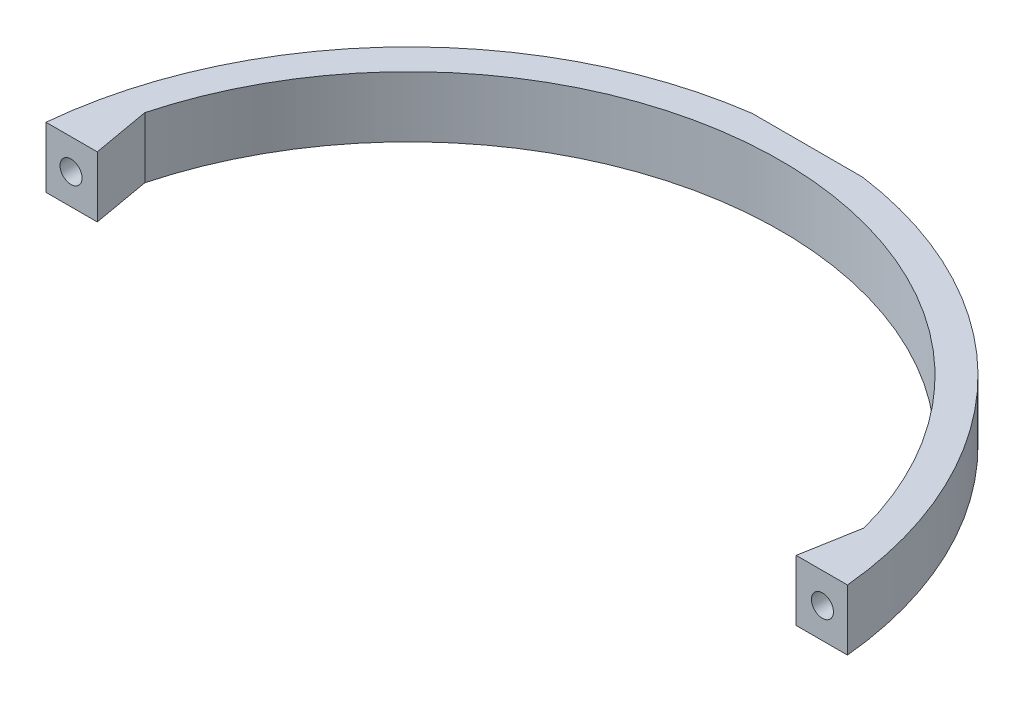
ISO-10303-21;
HEADER;
FILE_DESCRIPTION(('STEP AP214'),'2;1');
FILE_NAME('part.step','',(''),(''),'','','');
FILE_SCHEMA(('AUTOMOTIVE_DESIGN { 1 0 10303 214 1 1 1 1 }'));
ENDSEC;
DATA;
#1=APPLICATION_CONTEXT('core data for automotive mechanical design processes');
#2=APPLICATION_PROTOCOL_DEFINITION('international standard','automotive_design',2000,#1);
#3=PRODUCT_CONTEXT('',#1,'mechanical');
#4=PRODUCT('Part','Part','',(#3));
#5=PRODUCT_RELATED_PRODUCT_CATEGORY('part','',(#4));
#6=PRODUCT_DEFINITION_FORMATION('','',#4);
#7=PRODUCT_DEFINITION_CONTEXT('part definition',#1,'design');
#8=PRODUCT_DEFINITION('design','',#6,#7);
#9=PRODUCT_DEFINITION_SHAPE('','',#8);
#10=(LENGTH_UNIT() NAMED_UNIT(*) SI_UNIT(.MILLI.,.METRE.));
#11=(NAMED_UNIT(*) PLANE_ANGLE_UNIT() SI_UNIT($,.RADIAN.));
#12=(NAMED_UNIT(*) SI_UNIT($,.STERADIAN.) SOLID_ANGLE_UNIT());
#13=UNCERTAINTY_MEASURE_WITH_UNIT(LENGTH_MEASURE(1.E-05),#10,'distance_accuracy_value','');
#14=(GEOMETRIC_REPRESENTATION_CONTEXT(3) GLOBAL_UNCERTAINTY_ASSIGNED_CONTEXT((#13)) GLOBAL_UNIT_ASSIGNED_CONTEXT((#10,
#11,#12)) REPRESENTATION_CONTEXT('',''));
#15=CARTESIAN_POINT('',(0.,0.,0.));
#16=DIRECTION('',(0.,0.,1.));
#17=DIRECTION('',(1.,0.,0.));
#18=AXIS2_PLACEMENT_3D('',#15,#16,#17);
#19=CARTESIAN_POINT('',(0.,8.,0.));
#20=DIRECTION('',(0.,-1.,0.));
#21=DIRECTION('',(0.,0.,-1.));
#22=AXIS2_PLACEMENT_3D('',#19,#20,#21);
#23=CYLINDRICAL_SURFACE('',#22,53.);
#24=CARTESIAN_POINT('',(0.,0.,0.));
#25=DIRECTION('',(0.,1.,0.));
#26=DIRECTION('',(0.,0.,-1.));
#27=AXIS2_PLACEMENT_3D('',#24,#25,#26);
#28=CIRCLE('',#27,53.);
#29=CARTESIAN_POINT('',(52.7636238330917,0.,-5.));
#30=VERTEX_POINT('',#29);
#31=CARTESIAN_POINT('',(7.26291952316698,0.,-52.5));
#32=VERTEX_POINT('',#31);
#33=EDGE_CURVE('E131',#30,#32,#28,.T.);
#34=ORIENTED_EDGE('',*,*,#33,.T.);
#35=DIRECTION('',(0.,-1.,0.));
#36=VECTOR('',#35,1.);
#37=CARTESIAN_POINT('',(7.26291952316698,8.,-52.5));
#38=LINE('',#37,#36);
#39=CARTESIAN_POINT('',(7.26291952316698,8.,-52.5));
#40=VERTEX_POINT('',#39);
#41=EDGE_CURVE('E11',#40,#32,#38,.T.);
#42=ORIENTED_EDGE('',*,*,#41,.F.);
#43=CARTESIAN_POINT('',(0.,8.,0.));
#44=DIRECTION('',(0.,1.,0.));
#45=DIRECTION('',(0.,0.,-1.));
#46=AXIS2_PLACEMENT_3D('',#43,#44,#45);
#47=CIRCLE('',#46,53.);
#48=CARTESIAN_POINT('',(52.7636238330917,8.,-5.));
#49=VERTEX_POINT('',#48);
#50=EDGE_CURVE('E146',#49,#40,#47,.T.);
#51=ORIENTED_EDGE('',*,*,#50,.F.);
#52=DIRECTION('',(0.,-1.,0.));
#53=VECTOR('',#52,1.);
#54=CARTESIAN_POINT('',(52.7636238330917,8.,-5.));
#55=LINE('',#54,#53);
#56=EDGE_CURVE('E127',#49,#30,#55,.T.);
#57=ORIENTED_EDGE('',*,*,#56,.T.);
#58=EDGE_LOOP('',(#34,#42,#51,#57));
#59=FACE_BOUND('',#58,.T.);
#60=ADVANCED_FACE('F35',(#59),#23,.T.);
#61=CARTESIAN_POINT('',(-7.26291952316698,8.,-52.5));
#62=DIRECTION('',(0.,0.,1.));
#63=DIRECTION('',(1.,0.,0.));
#64=AXIS2_PLACEMENT_3D('',#61,#62,#63);
#65=PLANE('',#64);
#66=CARTESIAN_POINT('',(0.,4.,-52.5));
#67=DIRECTION('',(0.,0.,-1.));
#68=DIRECTION('',(-1.,0.,0.));
#69=AXIS2_PLACEMENT_3D('',#66,#67,#68);
#70=CIRCLE('',#69,3.025);
#71=CARTESIAN_POINT('',(-3.025,4.,-52.5));
#72=VERTEX_POINT('',#71);
#73=EDGE_CURVE('E179',#72,#72,#70,.T.);
#74=ORIENTED_EDGE('',*,*,#73,.F.);
#75=EDGE_LOOP('',(#74));
#76=FACE_BOUND('',#75,.T.);
#77=DIRECTION('',(-1.,0.,0.));
#78=VECTOR('',#77,1.);
#79=CARTESIAN_POINT('',(-7.26291952316698,0.,-52.5));
#80=LINE('',#79,#78);
#81=CARTESIAN_POINT('',(-7.26291952316698,0.,-52.5));
#82=VERTEX_POINT('',#81);
#83=EDGE_CURVE('E134',#32,#82,#80,.T.);
#84=ORIENTED_EDGE('',*,*,#83,.T.);
#85=DIRECTION('',(0.,-1.,0.));
#86=VECTOR('',#85,1.);
#87=CARTESIAN_POINT('',(-7.26291952316698,8.,-52.5));
#88=LINE('',#87,#86);
#89=CARTESIAN_POINT('',(-7.26291952316698,8.,-52.5));
#90=VERTEX_POINT('',#89);
#91=EDGE_CURVE('E43',#90,#82,#88,.T.);
#92=ORIENTED_EDGE('',*,*,#91,.F.);
#93=DIRECTION('',(-1.,0.,0.));
#94=VECTOR('',#93,1.);
#95=CARTESIAN_POINT('',(-7.26291952316698,8.,-52.5));
#96=LINE('',#95,#94);
#97=EDGE_CURVE('E94',#40,#90,#96,.T.);
#98=ORIENTED_EDGE('',*,*,#97,.F.);
#99=ORIENTED_EDGE('',*,*,#41,.T.);
#100=EDGE_LOOP('',(#84,#92,#98,#99));
#101=FACE_BOUND('',#100,.T.);
#102=ADVANCED_FACE('F225',(#76,#101),#65,.F.);
#103=CARTESIAN_POINT('',(0.,8.,0.));
#104=DIRECTION('',(0.,-1.,0.));
#105=DIRECTION('',(0.,0.,-1.));
#106=AXIS2_PLACEMENT_3D('',#103,#104,#105);
#107=CYLINDRICAL_SURFACE('',#106,53.);
#108=CARTESIAN_POINT('',(0.,0.,0.));
#109=DIRECTION('',(0.,1.,0.));
#110=DIRECTION('',(0.,0.,-1.));
#111=AXIS2_PLACEMENT_3D('',#108,#109,#110);
#112=CIRCLE('',#111,53.);
#113=CARTESIAN_POINT('',(-52.7636238330917,0.,-5.));
#114=VERTEX_POINT('',#113);
#115=EDGE_CURVE('E137',#82,#114,#112,.T.);
#116=ORIENTED_EDGE('',*,*,#115,.T.);
#117=DIRECTION('',(0.,-1.,0.));
#118=VECTOR('',#117,1.);
#119=CARTESIAN_POINT('',(-52.7636238330917,8.,-5.));
#120=LINE('',#119,#118);
#121=CARTESIAN_POINT('',(-52.7636238330917,8.,-5.));
#122=VERTEX_POINT('',#121);
#123=EDGE_CURVE('E153',#122,#114,#120,.T.);
#124=ORIENTED_EDGE('',*,*,#123,.F.);
#125=CARTESIAN_POINT('',(0.,8.,0.));
#126=DIRECTION('',(0.,1.,0.));
#127=DIRECTION('',(0.,0.,-1.));
#128=AXIS2_PLACEMENT_3D('',#125,#126,#127);
#129=CIRCLE('',#128,53.);
#130=EDGE_CURVE('E161',#90,#122,#129,.T.);
#131=ORIENTED_EDGE('',*,*,#130,.F.);
#132=ORIENTED_EDGE('',*,*,#91,.T.);
#133=EDGE_LOOP('',(#116,#124,#131,#132));
#134=FACE_BOUND('',#133,.T.);
#135=ADVANCED_FACE('F159',(#134),#107,.T.);
#136=CARTESIAN_POINT('',(-52.7636238330917,8.,-5.));
#137=DIRECTION('',(0.,0.,-1.));
#138=DIRECTION('',(-1.,0.,0.));
#139=AXIS2_PLACEMENT_3D('',#136,#137,#138);
#140=PLANE('',#139);
#141=CARTESIAN_POINT('',(-49.47,4.,-5.));
#142=DIRECTION('',(0.,0.,1.));
#143=DIRECTION('',(1.,0.,0.));
#144=AXIS2_PLACEMENT_3D('',#141,#142,#143);
#145=CIRCLE('',#144,1.45);
#146=CARTESIAN_POINT('',(-48.02,4.,-5.));
#147=VERTEX_POINT('',#146);
#148=EDGE_CURVE('E185',#147,#147,#145,.T.);
#149=ORIENTED_EDGE('',*,*,#148,.F.);
#150=EDGE_LOOP('',(#149));
#151=FACE_BOUND('',#150,.T.);
#152=DIRECTION('',(1.,0.,0.));
#153=VECTOR('',#152,1.);
#154=CARTESIAN_POINT('',(-52.7636238330917,0.,-5.));
#155=LINE('',#154,#153);
#156=CARTESIAN_POINT('',(-46.0136238330917,0.,-5.));
#157=VERTEX_POINT('',#156);
#158=EDGE_CURVE('E139',#114,#157,#155,.T.);
#159=ORIENTED_EDGE('',*,*,#158,.T.);
#160=DIRECTION('',(0.,-1.,0.));
#161=VECTOR('',#160,1.);
#162=CARTESIAN_POINT('',(-46.0136238330917,8.,-5.));
#163=LINE('',#162,#161);
#164=CARTESIAN_POINT('',(-46.0136238330917,8.,-5.));
#165=VERTEX_POINT('',#164);
#166=EDGE_CURVE('E150',#165,#157,#163,.T.);
#167=ORIENTED_EDGE('',*,*,#166,.F.);
#168=DIRECTION('',(1.,0.,0.));
#169=VECTOR('',#168,1.);
#170=CARTESIAN_POINT('',(-52.7636238330917,8.,-5.));
#171=LINE('',#170,#169);
#172=EDGE_CURVE('E173',#122,#165,#171,.T.);
#173=ORIENTED_EDGE('',*,*,#172,.F.);
#174=ORIENTED_EDGE('',*,*,#123,.T.);
#175=EDGE_LOOP('',(#159,#167,#173,#174));
#176=FACE_BOUND('',#175,.T.);
#177=ADVANCED_FACE('F169',(#151,#176),#140,.F.);
#178=CARTESIAN_POINT('',(-46.0136238330917,8.,-5.));
#179=DIRECTION('',(-0.984807753012207,0.,0.173648177666935));
#180=DIRECTION('',(0.173648177666935,0.,0.984807753012207));
#181=AXIS2_PLACEMENT_3D('',#178,#179,#180);
#182=PLANE('',#181);
#183=DIRECTION('',(-0.173648177666935,0.,-0.984807753012207));
#184=VECTOR('',#183,1.);
#185=CARTESIAN_POINT('',(-46.0136238330917,0.,-5.));
#186=LINE('',#185,#184);
#187=CARTESIAN_POINT('',(-47.3531459973294,0.,-12.5968076970162));
#188=VERTEX_POINT('',#187);
#189=EDGE_CURVE('E141',#157,#188,#186,.T.);
#190=ORIENTED_EDGE('',*,*,#189,.T.);
#191=DIRECTION('',(0.,-1.,0.));
#192=VECTOR('',#191,1.);
#193=CARTESIAN_POINT('',(-47.3531459973294,8.,-12.5968076970162));
#194=LINE('',#193,#192);
#195=CARTESIAN_POINT('',(-47.3531459973294,8.,-12.5968076970162));
#196=VERTEX_POINT('',#195);
#197=EDGE_CURVE('E122',#196,#188,#194,.T.);
#198=ORIENTED_EDGE('',*,*,#197,.F.);
#199=DIRECTION('',(-0.173648177666935,0.,-0.984807753012207));
#200=VECTOR('',#199,1.);
#201=CARTESIAN_POINT('',(-46.0136238330917,8.,-5.));
#202=LINE('',#201,#200);
#203=EDGE_CURVE('E113',#165,#196,#202,.T.);
#204=ORIENTED_EDGE('',*,*,#203,.F.);
#205=ORIENTED_EDGE('',*,*,#166,.T.);
#206=EDGE_LOOP('',(#190,#198,#204,#205));
#207=FACE_BOUND('',#206,.T.);
#208=ADVANCED_FACE('F172',(#207),#182,.F.);
#209=CARTESIAN_POINT('',(0.,8.,0.));
#210=DIRECTION('',(0.,-1.,0.));
#211=DIRECTION('',(0.,0.,-1.));
#212=AXIS2_PLACEMENT_3D('',#209,#210,#211);
#213=CYLINDRICAL_SURFACE('',#212,49.);
#214=CARTESIAN_POINT('',(0.,0.,0.));
#215=DIRECTION('',(0.,-1.,0.));
#216=DIRECTION('',(0.,0.,-1.));
#217=AXIS2_PLACEMENT_3D('',#214,#215,#216);
#218=CIRCLE('',#217,49.);
#219=CARTESIAN_POINT('',(47.3531459973294,0.,-12.5968076970162));
#220=VERTEX_POINT('',#219);
#221=EDGE_CURVE('E121',#188,#220,#218,.T.);
#222=ORIENTED_EDGE('',*,*,#221,.T.);
#223=DIRECTION('',(0.,-1.,0.));
#224=VECTOR('',#223,1.);
#225=CARTESIAN_POINT('',(47.3531459973294,8.,-12.5968076970162));
#226=LINE('',#225,#224);
#227=CARTESIAN_POINT('',(47.3531459973294,8.,-12.5968076970162));
#228=VERTEX_POINT('',#227);
#229=EDGE_CURVE('E118',#228,#220,#226,.T.);
#230=ORIENTED_EDGE('',*,*,#229,.F.);
#231=CARTESIAN_POINT('',(0.,8.,0.));
#232=DIRECTION('',(0.,-1.,0.));
#233=DIRECTION('',(0.,0.,-1.));
#234=AXIS2_PLACEMENT_3D('',#231,#232,#233);
#235=CIRCLE('',#234,49.);
#236=EDGE_CURVE('E107',#196,#228,#235,.T.);
#237=ORIENTED_EDGE('',*,*,#236,.F.);
#238=ORIENTED_EDGE('',*,*,#197,.T.);
#239=EDGE_LOOP('',(#222,#230,#237,#238));
#240=FACE_BOUND('',#239,.T.);
#241=ADVANCED_FACE('F119',(#240),#213,.F.);
#242=CARTESIAN_POINT('',(46.0136238330917,8.,-5.));
#243=DIRECTION('',(0.984807753012207,0.,0.173648177666935));
#244=DIRECTION('',(0.173648177666935,0.,-0.984807753012207));
#245=AXIS2_PLACEMENT_3D('',#242,#243,#244);
#246=PLANE('',#245);
#247=DIRECTION('',(-0.173648177666935,0.,0.984807753012207));
#248=VECTOR('',#247,1.);
#249=CARTESIAN_POINT('',(46.0136238330917,0.,-5.));
#250=LINE('',#249,#248);
#251=CARTESIAN_POINT('',(46.0136238330917,0.,-5.));
#252=VERTEX_POINT('',#251);
#253=EDGE_CURVE('E80',#220,#252,#250,.T.);
#254=ORIENTED_EDGE('',*,*,#253,.T.);
#255=DIRECTION('',(0.,-1.,0.));
#256=VECTOR('',#255,1.);
#257=CARTESIAN_POINT('',(46.0136238330917,8.,-5.));
#258=LINE('',#257,#256);
#259=CARTESIAN_POINT('',(46.0136238330917,8.,-5.));
#260=VERTEX_POINT('',#259);
#261=EDGE_CURVE('E123',#260,#252,#258,.T.);
#262=ORIENTED_EDGE('',*,*,#261,.F.);
#263=DIRECTION('',(-0.173648177666935,0.,0.984807753012207));
#264=VECTOR('',#263,1.);
#265=CARTESIAN_POINT('',(46.0136238330917,8.,-5.));
#266=LINE('',#265,#264);
#267=EDGE_CURVE('E111',#228,#260,#266,.T.);
#268=ORIENTED_EDGE('',*,*,#267,.F.);
#269=ORIENTED_EDGE('',*,*,#229,.T.);
#270=EDGE_LOOP('',(#254,#262,#268,#269));
#271=FACE_BOUND('',#270,.T.);
#272=ADVANCED_FACE('F125',(#271),#246,.F.);
#273=CARTESIAN_POINT('',(52.7636238330917,8.,-5.));
#274=DIRECTION('',(0.,0.,-1.));
#275=DIRECTION('',(-1.,0.,0.));
#276=AXIS2_PLACEMENT_3D('',#273,#274,#275);
#277=PLANE('',#276);
#278=CARTESIAN_POINT('',(49.47,4.,-5.));
#279=DIRECTION('',(0.,0.,-1.));
#280=DIRECTION('',(-1.,0.,0.));
#281=AXIS2_PLACEMENT_3D('',#278,#279,#280);
#282=CIRCLE('',#281,1.45);
#283=CARTESIAN_POINT('',(50.92,4.,-5.));
#284=VERTEX_POINT('',#283);
#285=EDGE_CURVE('E191',#284,#284,#282,.T.);
#286=ORIENTED_EDGE('',*,*,#285,.T.);
#287=EDGE_LOOP('',(#286));
#288=FACE_BOUND('',#287,.T.);
#289=DIRECTION('',(1.,0.,0.));
#290=VECTOR('',#289,1.);
#291=CARTESIAN_POINT('',(52.7636238330917,0.,-5.));
#292=LINE('',#291,#290);
#293=EDGE_CURVE('E86',#252,#30,#292,.T.);
#294=ORIENTED_EDGE('',*,*,#293,.T.);
#295=ORIENTED_EDGE('',*,*,#56,.F.);
#296=DIRECTION('',(1.,0.,0.));
#297=VECTOR('',#296,1.);
#298=CARTESIAN_POINT('',(52.7636238330917,8.,-5.));
#299=LINE('',#298,#297);
#300=EDGE_CURVE('E51',#260,#49,#299,.T.);
#301=ORIENTED_EDGE('',*,*,#300,.F.);
#302=ORIENTED_EDGE('',*,*,#261,.T.);
#303=EDGE_LOOP('',(#294,#295,#301,#302));
#304=FACE_BOUND('',#303,.T.);
#305=ADVANCED_FACE('F230',(#288,#304),#277,.F.);
#306=CARTESIAN_POINT('',(0.,8.,0.));
#307=DIRECTION('',(0.,-1.,0.));
#308=DIRECTION('',(0.,0.,-1.));
#309=AXIS2_PLACEMENT_3D('',#306,#307,#308);
#310=PLANE('',#309);
#311=ORIENTED_EDGE('',*,*,#50,.T.);
#312=ORIENTED_EDGE('',*,*,#97,.T.);
#313=ORIENTED_EDGE('',*,*,#130,.T.);
#314=ORIENTED_EDGE('',*,*,#172,.T.);
#315=ORIENTED_EDGE('',*,*,#203,.T.);
#316=ORIENTED_EDGE('',*,*,#236,.T.);
#317=ORIENTED_EDGE('',*,*,#267,.T.);
#318=ORIENTED_EDGE('',*,*,#300,.T.);
#319=EDGE_LOOP('',(#311,#312,#313,#314,#315,#316,#317,#318));
#320=FACE_BOUND('',#319,.T.);
#321=ADVANCED_FACE('F109',(#320),#310,.F.);
#322=CARTESIAN_POINT('',(0.,0.,0.));
#323=DIRECTION('',(0.,-1.,0.));
#324=DIRECTION('',(0.,0.,-1.));
#325=AXIS2_PLACEMENT_3D('',#322,#323,#324);
#326=PLANE('',#325);
#327=ORIENTED_EDGE('',*,*,#33,.F.);
#328=ORIENTED_EDGE('',*,*,#293,.F.);
#329=ORIENTED_EDGE('',*,*,#253,.F.);
#330=ORIENTED_EDGE('',*,*,#221,.F.);
#331=ORIENTED_EDGE('',*,*,#189,.F.);
#332=ORIENTED_EDGE('',*,*,#158,.F.);
#333=ORIENTED_EDGE('',*,*,#115,.F.);
#334=ORIENTED_EDGE('',*,*,#83,.F.);
#335=EDGE_LOOP('',(#327,#328,#329,#330,#331,#332,#333,#334));
#336=FACE_BOUND('',#335,.T.);
#337=ADVANCED_FACE('F165',(#336),#326,.T.);
#338=CARTESIAN_POINT('',(0.,4.,-50.4));
#339=DIRECTION('',(0.,0.,-1.));
#340=DIRECTION('',(-1.,0.,0.));
#341=AXIS2_PLACEMENT_3D('',#338,#339,#340);
#342=CYLINDRICAL_SURFACE('',#341,3.025);
#343=CARTESIAN_POINT('',(0.,4.,-50.4));
#344=DIRECTION('',(0.,0.,-1.));
#345=DIRECTION('',(-1.,0.,0.));
#346=AXIS2_PLACEMENT_3D('',#343,#344,#345);
#347=CIRCLE('',#346,3.025);
#348=CARTESIAN_POINT('',(-3.025,4.,-50.4));
#349=VERTEX_POINT('',#348);
#350=EDGE_CURVE('E135',#349,#349,#347,.T.);
#351=ORIENTED_EDGE('',*,*,#350,.F.);
#352=EDGE_LOOP('',(#351));
#353=FACE_BOUND('',#352,.T.);
#354=ORIENTED_EDGE('',*,*,#73,.T.);
#355=EDGE_LOOP('',(#354));
#356=FACE_BOUND('',#355,.T.);
#357=ADVANCED_FACE('F216',(#353,#356),#342,.F.);
#358=CARTESIAN_POINT('',(0.,4.,-50.4));
#359=DIRECTION('',(0.,0.,-1.));
#360=DIRECTION('',(-1.,0.,0.));
#361=AXIS2_PLACEMENT_3D('',#358,#359,#360);
#362=PLANE('',#361);
#363=CARTESIAN_POINT('',(0.,4.,-50.4));
#364=DIRECTION('',(0.,0.,-1.));
#365=DIRECTION('',(-1.,0.,0.));
#366=AXIS2_PLACEMENT_3D('',#363,#364,#365);
#367=CIRCLE('',#366,1.75);
#368=CARTESIAN_POINT('',(-1.75,4.,-50.4));
#369=VERTEX_POINT('',#368);
#370=EDGE_CURVE('E197',#369,#369,#367,.T.);
#371=ORIENTED_EDGE('',*,*,#370,.F.);
#372=EDGE_LOOP('',(#371));
#373=FACE_BOUND('',#372,.T.);
#374=ORIENTED_EDGE('',*,*,#350,.T.);
#375=EDGE_LOOP('',(#374));
#376=FACE_BOUND('',#375,.T.);
#377=ADVANCED_FACE('F212',(#373,#376),#362,.T.);
#378=CARTESIAN_POINT('',(-49.47,4.,-11.5));
#379=DIRECTION('',(0.,0.,1.));
#380=DIRECTION('',(1.,0.,0.));
#381=AXIS2_PLACEMENT_3D('',#378,#379,#380);
#382=CYLINDRICAL_SURFACE('',#381,1.45);
#383=CARTESIAN_POINT('',(-49.47,4.,-11.5));
#384=DIRECTION('',(0.,0.,1.));
#385=DIRECTION('',(1.,0.,0.));
#386=AXIS2_PLACEMENT_3D('',#383,#384,#385);
#387=CIRCLE('',#386,1.45);
#388=CARTESIAN_POINT('',(-48.02,4.,-11.5));
#389=VERTEX_POINT('',#388);
#390=EDGE_CURVE('E182',#389,#389,#387,.T.);
#391=CARTESIAN_POINT('',(-48.02,4.,-11.5));
#392=CARTESIAN_POINT('',(-48.02,4.,-11.4322916666667));
#393=CARTESIAN_POINT('',(-48.02,4.,-11.3645833333333));
#394=CARTESIAN_POINT('',(-48.02,4.,-11.2291666666667));
#395=CARTESIAN_POINT('',(-48.02,4.,-11.1614583333333));
#396=CARTESIAN_POINT('',(-48.02,4.,-11.0260416666667));
#397=CARTESIAN_POINT('',(-48.02,4.,-10.9583333333333));
#398=CARTESIAN_POINT('',(-48.02,4.,-10.8229166666667));
#399=CARTESIAN_POINT('',(-48.02,4.,-10.7552083333333));
#400=CARTESIAN_POINT('',(-48.02,4.,-10.6197916666667));
#401=CARTESIAN_POINT('',(-48.02,4.,-10.5520833333333));
#402=CARTESIAN_POINT('',(-48.02,4.,-10.4166666666667));
#403=CARTESIAN_POINT('',(-48.02,4.,-10.3489583333333));
#404=CARTESIAN_POINT('',(-48.02,4.,-10.2135416666667));
#405=CARTESIAN_POINT('',(-48.02,4.,-10.1458333333333));
#406=CARTESIAN_POINT('',(-48.02,4.,-10.0104166666667));
#407=CARTESIAN_POINT('',(-48.02,4.,-9.94270833333333));
#408=CARTESIAN_POINT('',(-48.02,4.,-9.80729166666667));
#409=CARTESIAN_POINT('',(-48.02,4.,-9.73958333333333));
#410=CARTESIAN_POINT('',(-48.02,4.,-9.60416666666667));
#411=CARTESIAN_POINT('',(-48.02,4.,-9.53645833333333));
#412=CARTESIAN_POINT('',(-48.02,4.,-9.40104166666667));
#413=CARTESIAN_POINT('',(-48.02,4.,-9.33333333333333));
#414=CARTESIAN_POINT('',(-48.02,4.,-9.19791666666667));
#415=CARTESIAN_POINT('',(-48.02,4.,-9.13020833333333));
#416=CARTESIAN_POINT('',(-48.02,4.,-8.99479166666667));
#417=CARTESIAN_POINT('',(-48.02,4.,-8.92708333333333));
#418=CARTESIAN_POINT('',(-48.02,4.,-8.79166666666667));
#419=CARTESIAN_POINT('',(-48.02,4.,-8.72395833333333));
#420=CARTESIAN_POINT('',(-48.02,4.,-8.58854166666667));
#421=CARTESIAN_POINT('',(-48.02,4.,-8.52083333333333));
#422=CARTESIAN_POINT('',(-48.02,4.,-8.38541666666667));
#423=CARTESIAN_POINT('',(-48.02,4.,-8.31770833333333));
#424=CARTESIAN_POINT('',(-48.02,4.,-8.18229166666667));
#425=CARTESIAN_POINT('',(-48.02,4.,-8.11458333333333));
#426=CARTESIAN_POINT('',(-48.02,4.,-7.97916666666667));
#427=CARTESIAN_POINT('',(-48.02,4.,-7.91145833333333));
#428=CARTESIAN_POINT('',(-48.02,4.,-7.77604166666667));
#429=CARTESIAN_POINT('',(-48.02,4.,-7.70833333333333));
#430=CARTESIAN_POINT('',(-48.02,4.,-7.57291666666667));
#431=CARTESIAN_POINT('',(-48.02,4.,-7.50520833333333));
#432=CARTESIAN_POINT('',(-48.02,4.,-7.36979166666667));
#433=CARTESIAN_POINT('',(-48.02,4.,-7.30208333333333));
#434=CARTESIAN_POINT('',(-48.02,4.,-7.16666666666667));
#435=CARTESIAN_POINT('',(-48.02,4.,-7.09895833333333));
#436=CARTESIAN_POINT('',(-48.02,4.,-6.96354166666667));
#437=CARTESIAN_POINT('',(-48.02,4.,-6.89583333333333));
#438=CARTESIAN_POINT('',(-48.02,4.,-6.76041666666667));
#439=CARTESIAN_POINT('',(-48.02,4.,-6.69270833333333));
#440=CARTESIAN_POINT('',(-48.02,4.,-6.55729166666667));
#441=CARTESIAN_POINT('',(-48.02,4.,-6.48958333333333));
#442=CARTESIAN_POINT('',(-48.02,4.,-6.35416666666667));
#443=CARTESIAN_POINT('',(-48.02,4.,-6.28645833333333));
#444=CARTESIAN_POINT('',(-48.02,4.,-6.15104166666667));
#445=CARTESIAN_POINT('',(-48.02,4.,-6.08333333333333));
#446=CARTESIAN_POINT('',(-48.02,4.,-5.94791666666667));
#447=CARTESIAN_POINT('',(-48.02,4.,-5.88020833333333));
#448=CARTESIAN_POINT('',(-48.02,4.,-5.74479166666667));
#449=CARTESIAN_POINT('',(-48.02,4.,-5.67708333333333));
#450=CARTESIAN_POINT('',(-48.02,4.,-5.54166666666667));
#451=CARTESIAN_POINT('',(-48.02,4.,-5.47395833333333));
#452=CARTESIAN_POINT('',(-48.02,4.,-5.33854166666667));
#453=CARTESIAN_POINT('',(-48.02,4.,-5.27083333333333));
#454=CARTESIAN_POINT('',(-48.02,4.,-5.13541666666667));
#455=CARTESIAN_POINT('',(-48.02,4.,-5.06770833333333));
#456=CARTESIAN_POINT('',(-48.02,4.,-5.));
#457=B_SPLINE_CURVE_WITH_KNOTS('',3,(#391,#392,#393,#394,#395,#396,#397,#398,#399,#400,#401,
#402,#403,#404,#405,#406,#407,#408,#409,#410,#411,#412,#413,#414,#415,#416,#417,#418,#419,#420,
#421,#422,#423,#424,#425,#426,#427,#428,#429,#430,#431,#432,#433,#434,#435,#436,#437,#438,#439,
#440,#441,#442,#443,#444,#445,#446,#447,#448,#449,#450,#451,#452,#453,#454,#455,#456),
.UNSPECIFIED.,.F.,.F.,(4,2,2,2,2,2,2,2,2,2,2,2,2,2,2,2,2,2,2,2,2,2,2,2,2,2,2,2,2,2,2,2,4),(0.,
0.203124999999998,0.406249999999999,0.609374999999999,0.812499999999999,1.015625,1.21875,
1.421875,1.625,1.828125,2.03125,2.234375,2.4375,2.640625,2.84375,3.046875,3.25,3.453125,3.65625,
3.859375,4.0625,4.265625,4.46875,4.671875,4.875,5.078125,5.28125,5.484375,5.6875,5.890625,
6.09375,6.296875,6.5),.UNSPECIFIED.);
#458=EDGE_CURVE('BSEAM215',#389,#147,#457,.T.);
#459=ORIENTED_EDGE('',*,*,#390,.F.);
#460=ORIENTED_EDGE('',*,*,#148,.T.);
#461=ORIENTED_EDGE('',*,*,#458,.T.);
#462=ORIENTED_EDGE('',*,*,#458,.F.);
#463=EDGE_LOOP('',(#459,#461,#460,#462));
#464=FACE_BOUND('',#463,.T.);
#465=ADVANCED_FACE('F215',(#464),#382,.F.);
#466=CARTESIAN_POINT('',(-49.47,4.,-11.5));
#467=DIRECTION('',(0.,0.,1.));
#468=DIRECTION('',(1.,0.,0.));
#469=AXIS2_PLACEMENT_3D('',#466,#467,#468);
#470=PLANE('',#469);
#471=ORIENTED_EDGE('',*,*,#390,.T.);
#472=EDGE_LOOP('',(#471));
#473=FACE_BOUND('',#472,.T.);
#474=ADVANCED_FACE('F309',(#473),#470,.T.);
#475=CARTESIAN_POINT('',(49.47,4.,-11.5));
#476=DIRECTION('',(0.,0.,1.));
#477=DIRECTION('',(1.,0.,0.));
#478=AXIS2_PLACEMENT_3D('',#475,#476,#477);
#479=CYLINDRICAL_SURFACE('',#478,1.45);
#480=CARTESIAN_POINT('',(49.47,4.,-11.5));
#481=DIRECTION('',(0.,0.,-1.));
#482=DIRECTION('',(-1.,0.,0.));
#483=AXIS2_PLACEMENT_3D('',#480,#481,#482);
#484=CIRCLE('',#483,1.45);
#485=CARTESIAN_POINT('',(50.92,4.,-11.5));
#486=VERTEX_POINT('',#485);
#487=EDGE_CURVE('E188',#486,#486,#484,.T.);
#488=CARTESIAN_POINT('',(50.92,4.,-11.5));
#489=CARTESIAN_POINT('',(50.92,4.,-11.4322916666667));
#490=CARTESIAN_POINT('',(50.92,4.,-11.3645833333333));
#491=CARTESIAN_POINT('',(50.92,4.,-11.2291666666667));
#492=CARTESIAN_POINT('',(50.92,4.,-11.1614583333333));
#493=CARTESIAN_POINT('',(50.92,4.,-11.0260416666667));
#494=CARTESIAN_POINT('',(50.92,4.,-10.9583333333333));
#495=CARTESIAN_POINT('',(50.92,4.,-10.8229166666667));
#496=CARTESIAN_POINT('',(50.92,4.,-10.7552083333333));
#497=CARTESIAN_POINT('',(50.92,4.,-10.6197916666667));
#498=CARTESIAN_POINT('',(50.92,4.,-10.5520833333333));
#499=CARTESIAN_POINT('',(50.92,4.,-10.4166666666667));
#500=CARTESIAN_POINT('',(50.92,4.,-10.3489583333333));
#501=CARTESIAN_POINT('',(50.92,4.,-10.2135416666667));
#502=CARTESIAN_POINT('',(50.92,4.,-10.1458333333333));
#503=CARTESIAN_POINT('',(50.92,4.,-10.0104166666667));
#504=CARTESIAN_POINT('',(50.92,4.,-9.94270833333333));
#505=CARTESIAN_POINT('',(50.92,4.,-9.80729166666667));
#506=CARTESIAN_POINT('',(50.92,4.,-9.73958333333333));
#507=CARTESIAN_POINT('',(50.92,4.,-9.60416666666667));
#508=CARTESIAN_POINT('',(50.92,4.,-9.53645833333333));
#509=CARTESIAN_POINT('',(50.92,4.,-9.40104166666667));
#510=CARTESIAN_POINT('',(50.92,4.,-9.33333333333333));
#511=CARTESIAN_POINT('',(50.92,4.,-9.19791666666667));
#512=CARTESIAN_POINT('',(50.92,4.,-9.13020833333333));
#513=CARTESIAN_POINT('',(50.92,4.,-8.99479166666667));
#514=CARTESIAN_POINT('',(50.92,4.,-8.92708333333333));
#515=CARTESIAN_POINT('',(50.92,4.,-8.79166666666667));
#516=CARTESIAN_POINT('',(50.92,4.,-8.72395833333333));
#517=CARTESIAN_POINT('',(50.92,4.,-8.58854166666667));
#518=CARTESIAN_POINT('',(50.92,4.,-8.52083333333333));
#519=CARTESIAN_POINT('',(50.92,4.,-8.38541666666667));
#520=CARTESIAN_POINT('',(50.92,4.,-8.31770833333333));
#521=CARTESIAN_POINT('',(50.92,4.,-8.18229166666667));
#522=CARTESIAN_POINT('',(50.92,4.,-8.11458333333333));
#523=CARTESIAN_POINT('',(50.92,4.,-7.97916666666667));
#524=CARTESIAN_POINT('',(50.92,4.,-7.91145833333333));
#525=CARTESIAN_POINT('',(50.92,4.,-7.77604166666667));
#526=CARTESIAN_POINT('',(50.92,4.,-7.70833333333333));
#527=CARTESIAN_POINT('',(50.92,4.,-7.57291666666667));
#528=CARTESIAN_POINT('',(50.92,4.,-7.50520833333333));
#529=CARTESIAN_POINT('',(50.92,4.,-7.36979166666667));
#530=CARTESIAN_POINT('',(50.92,4.,-7.30208333333333));
#531=CARTESIAN_POINT('',(50.92,4.,-7.16666666666667));
#532=CARTESIAN_POINT('',(50.92,4.,-7.09895833333333));
#533=CARTESIAN_POINT('',(50.92,4.,-6.96354166666667));
#534=CARTESIAN_POINT('',(50.92,4.,-6.89583333333333));
#535=CARTESIAN_POINT('',(50.92,4.,-6.76041666666667));
#536=CARTESIAN_POINT('',(50.92,4.,-6.69270833333333));
#537=CARTESIAN_POINT('',(50.92,4.,-6.55729166666667));
#538=CARTESIAN_POINT('',(50.92,4.,-6.48958333333333));
#539=CARTESIAN_POINT('',(50.92,4.,-6.35416666666667));
#540=CARTESIAN_POINT('',(50.92,4.,-6.28645833333333));
#541=CARTESIAN_POINT('',(50.92,4.,-6.15104166666667));
#542=CARTESIAN_POINT('',(50.92,4.,-6.08333333333333));
#543=CARTESIAN_POINT('',(50.92,4.,-5.94791666666667));
#544=CARTESIAN_POINT('',(50.92,4.,-5.88020833333333));
#545=CARTESIAN_POINT('',(50.92,4.,-5.74479166666667));
#546=CARTESIAN_POINT('',(50.92,4.,-5.67708333333333));
#547=CARTESIAN_POINT('',(50.92,4.,-5.54166666666667));
#548=CARTESIAN_POINT('',(50.92,4.,-5.47395833333333));
#549=CARTESIAN_POINT('',(50.92,4.,-5.33854166666667));
#550=CARTESIAN_POINT('',(50.92,4.,-5.27083333333333));
#551=CARTESIAN_POINT('',(50.92,4.,-5.13541666666667));
#552=CARTESIAN_POINT('',(50.92,4.,-5.06770833333333));
#553=CARTESIAN_POINT('',(50.92,4.,-5.));
#554=B_SPLINE_CURVE_WITH_KNOTS('',3,(#488,#489,#490,#491,#492,#493,#494,#495,#496,#497,#498,
#499,#500,#501,#502,#503,#504,#505,#506,#507,#508,#509,#510,#511,#512,#513,#514,#515,#516,#517,
#518,#519,#520,#521,#522,#523,#524,#525,#526,#527,#528,#529,#530,#531,#532,#533,#534,#535,#536,
#537,#538,#539,#540,#541,#542,#543,#544,#545,#546,#547,#548,#549,#550,#551,#552,#553),
.UNSPECIFIED.,.F.,.F.,(4,2,2,2,2,2,2,2,2,2,2,2,2,2,2,2,2,2,2,2,2,2,2,2,2,2,2,2,2,2,2,2,4),(0.,
0.203125,0.40625,0.609375000000001,0.812500000000001,1.015625,1.21875,1.421875,1.625,1.828125,
2.03125,2.234375,2.4375,2.640625,2.84375,3.046875,3.25,3.453125,3.65625,3.859375,4.0625,
4.265625,4.46875,4.671875,4.875,5.078125,5.28125,5.484375,5.6875,5.890625,6.09375,6.296875,6.5),.UNSPECIFIED.);
#555=EDGE_CURVE('BSEAM317',#486,#284,#554,.T.);
#556=ORIENTED_EDGE('',*,*,#487,.T.);
#557=ORIENTED_EDGE('',*,*,#285,.F.);
#558=ORIENTED_EDGE('',*,*,#555,.T.);
#559=ORIENTED_EDGE('',*,*,#555,.F.);
#560=EDGE_LOOP('',(#556,#558,#557,#559));
#561=FACE_BOUND('',#560,.T.);
#562=ADVANCED_FACE('F317',(#561),#479,.F.);
#563=CARTESIAN_POINT('',(49.47,4.,-11.5));
#564=DIRECTION('',(0.,0.,1.));
#565=DIRECTION('',(-1.,0.,0.));
#566=AXIS2_PLACEMENT_3D('',#563,#564,#565);
#567=PLANE('',#566);
#568=ORIENTED_EDGE('',*,*,#487,.F.);
#569=EDGE_LOOP('',(#568));
#570=FACE_BOUND('',#569,.T.);
#571=ADVANCED_FACE('F208',(#570),#567,.T.);
#572=CARTESIAN_POINT('',(0.,4.,-49.99));
#573=DIRECTION('',(0.,0.,-1.));
#574=DIRECTION('',(-1.,0.,0.));
#575=AXIS2_PLACEMENT_3D('',#572,#573,#574);
#576=CYLINDRICAL_SURFACE('',#575,1.75);
#577=CARTESIAN_POINT('',(0.,4.,-49.99));
#578=DIRECTION('',(0.,0.,-1.));
#579=DIRECTION('',(-1.,0.,0.));
#580=AXIS2_PLACEMENT_3D('',#577,#578,#579);
#581=CIRCLE('',#580,1.75);
#582=CARTESIAN_POINT('',(-1.75,4.,-49.99));
#583=VERTEX_POINT('',#582);
#584=EDGE_CURVE('E194',#583,#583,#581,.T.);
#585=ORIENTED_EDGE('',*,*,#584,.F.);
#586=EDGE_LOOP('',(#585));
#587=FACE_BOUND('',#586,.T.);
#588=ORIENTED_EDGE('',*,*,#370,.T.);
#589=EDGE_LOOP('',(#588));
#590=FACE_BOUND('',#589,.T.);
#591=ADVANCED_FACE('F205',(#587,#590),#576,.F.);
#592=CARTESIAN_POINT('',(0.,4.,-49.99));
#593=DIRECTION('',(0.,0.,-1.));
#594=DIRECTION('',(-1.,0.,0.));
#595=AXIS2_PLACEMENT_3D('',#592,#593,#594);
#596=PLANE('',#595);
#597=ORIENTED_EDGE('',*,*,#584,.T.);
#598=EDGE_LOOP('',(#597));
#599=FACE_BOUND('',#598,.T.);
#600=ADVANCED_FACE('F203',(#599),#596,.T.);
#601=CLOSED_SHELL('',(#60,#102,#135,#177,#208,#241,#272,#305,#321,#337,#357,#377,#465,#474,#562,
#571,#591,#600));
#602=MANIFOLD_SOLID_BREP('B2',#601);
#603=ADVANCED_BREP_SHAPE_REPRESENTATION('',(#18,#602),#14);
#604=SHAPE_DEFINITION_REPRESENTATION(#9,#603);
ENDSEC;
END-ISO-10303-21;
